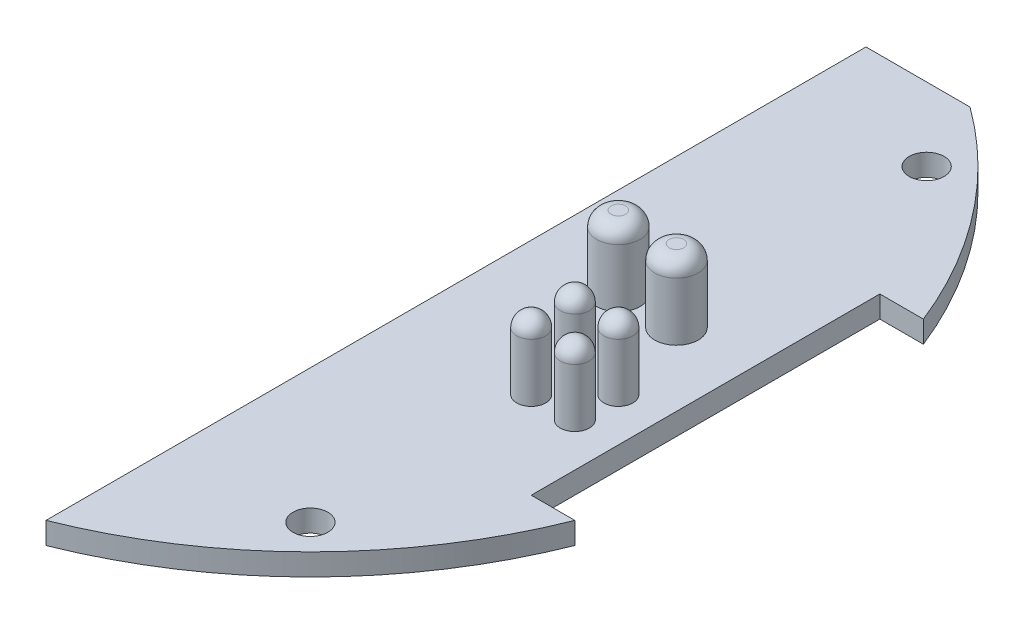
ISO-10303-21;
HEADER;
FILE_DESCRIPTION(('STEP AP214'),'2;1');
FILE_NAME('part.step','',(''),(''),'','','');
FILE_SCHEMA(('AUTOMOTIVE_DESIGN { 1 0 10303 214 1 1 1 1 }'));
ENDSEC;
DATA;
#1=APPLICATION_CONTEXT('core data for automotive mechanical design processes');
#2=APPLICATION_PROTOCOL_DEFINITION('international standard','automotive_design',2000,#1);
#3=PRODUCT_CONTEXT('',#1,'mechanical');
#4=PRODUCT('Part','Part','',(#3));
#5=PRODUCT_RELATED_PRODUCT_CATEGORY('part','',(#4));
#6=PRODUCT_DEFINITION_FORMATION('','',#4);
#7=PRODUCT_DEFINITION_CONTEXT('part definition',#1,'design');
#8=PRODUCT_DEFINITION('design','',#6,#7);
#9=PRODUCT_DEFINITION_SHAPE('','',#8);
#10=(LENGTH_UNIT() NAMED_UNIT(*) SI_UNIT(.MILLI.,.METRE.));
#11=(NAMED_UNIT(*) PLANE_ANGLE_UNIT() SI_UNIT($,.RADIAN.));
#12=(NAMED_UNIT(*) SI_UNIT($,.STERADIAN.) SOLID_ANGLE_UNIT());
#13=UNCERTAINTY_MEASURE_WITH_UNIT(LENGTH_MEASURE(1.E-05),#10,'distance_accuracy_value','');
#14=(GEOMETRIC_REPRESENTATION_CONTEXT(3) GLOBAL_UNCERTAINTY_ASSIGNED_CONTEXT((#13)) GLOBAL_UNIT_ASSIGNED_CONTEXT((#10,
#11,#12)) REPRESENTATION_CONTEXT('',''));
#15=CARTESIAN_POINT('',(0.,0.,0.));
#16=DIRECTION('',(0.,0.,1.));
#17=DIRECTION('',(1.,0.,0.));
#18=AXIS2_PLACEMENT_3D('',#15,#16,#17);
#19=CARTESIAN_POINT('',(0.,1.5,0.));
#20=DIRECTION('',(0.,-1.,0.));
#21=DIRECTION('',(0.,0.,-1.));
#22=AXIS2_PLACEMENT_3D('',#19,#20,#21);
#23=CYLINDRICAL_SURFACE('',#22,32.5);
#24=CARTESIAN_POINT('',(0.,0.,0.));
#25=DIRECTION('',(0.,1.,0.));
#26=DIRECTION('',(0.,0.,1.));
#27=AXIS2_PLACEMENT_3D('',#24,#25,#26);
#28=CIRCLE('',#27,32.5);
#29=CARTESIAN_POINT('',(11.9999999999999,0.,30.203476621078));
#30=VERTEX_POINT('',#29);
#31=CARTESIAN_POINT('',(30.2034766210779,0.,12.));
#32=VERTEX_POINT('',#31);
#33=EDGE_CURVE('E52',#30,#32,#28,.T.);
#34=ORIENTED_EDGE('',*,*,#33,.T.);
#35=DIRECTION('',(0.,1.,0.));
#36=VECTOR('',#35,1.);
#37=CARTESIAN_POINT('',(30.2034766210779,0.,12.));
#38=LINE('',#37,#36);
#39=CARTESIAN_POINT('',(30.2034766210779,1.5,12.));
#40=VERTEX_POINT('',#39);
#41=EDGE_CURVE('E144',#32,#40,#38,.T.);
#42=ORIENTED_EDGE('',*,*,#41,.T.);
#43=CARTESIAN_POINT('',(0.,1.5,0.));
#44=DIRECTION('',(0.,1.,0.));
#45=DIRECTION('',(0.,0.,1.));
#46=AXIS2_PLACEMENT_3D('',#43,#44,#45);
#47=CIRCLE('',#46,32.5);
#48=CARTESIAN_POINT('',(11.9999999999999,1.5,30.203476621078));
#49=VERTEX_POINT('',#48);
#50=EDGE_CURVE('E148',#49,#40,#47,.T.);
#51=ORIENTED_EDGE('',*,*,#50,.F.);
#52=DIRECTION('',(0.,1.,0.));
#53=VECTOR('',#52,1.);
#54=CARTESIAN_POINT('',(11.9999999999999,0.,30.203476621078));
#55=LINE('',#54,#53);
#56=EDGE_CURVE('E165',#30,#49,#55,.T.);
#57=ORIENTED_EDGE('',*,*,#56,.F.);
#58=EDGE_LOOP('',(#34,#42,#51,#57));
#59=FACE_BOUND('',#58,.T.);
#60=ADVANCED_FACE('F47',(#59),#23,.T.);
#61=CARTESIAN_POINT('',(0.,1.5,0.));
#62=DIRECTION('',(0.,1.,0.));
#63=DIRECTION('',(0.,0.,1.));
#64=AXIS2_PLACEMENT_3D('',#61,#62,#63);
#65=PLANE('',#64);
#66=DIRECTION('',(1.,0.,0.));
#67=VECTOR('',#66,1.);
#68=CARTESIAN_POINT('',(16.9999999999999,1.5,-26.2499999999999));
#69=LINE('',#68,#67);
#70=CARTESIAN_POINT('',(11.9999999999999,1.5,-26.25));
#71=VERTEX_POINT('',#70);
#72=CARTESIAN_POINT('',(19.162137145945,1.5,-26.2499999999999));
#73=VERTEX_POINT('',#72);
#74=EDGE_CURVE('E123',#71,#73,#69,.T.);
#75=ORIENTED_EDGE('',*,*,#74,.F.);
#76=DIRECTION('',(0.,0.,-1.));
#77=VECTOR('',#76,1.);
#78=CARTESIAN_POINT('',(11.9999999999999,1.5,30.203476621078));
#79=LINE('',#78,#77);
#80=EDGE_CURVE('E73',#49,#71,#79,.T.);
#81=ORIENTED_EDGE('',*,*,#80,.F.);
#82=ORIENTED_EDGE('',*,*,#50,.T.);
#83=DIRECTION('',(1.,0.,0.));
#84=VECTOR('',#83,1.);
#85=CARTESIAN_POINT('',(30.2034766210779,1.5,12.));
#86=LINE('',#85,#84);
#87=CARTESIAN_POINT('',(27.2034766210779,1.5,12.));
#88=VERTEX_POINT('',#87);
#89=EDGE_CURVE('E163',#88,#40,#86,.T.);
#90=ORIENTED_EDGE('',*,*,#89,.F.);
#91=DIRECTION('',(0.,0.,1.));
#92=VECTOR('',#91,1.);
#93=CARTESIAN_POINT('',(27.2034766210779,1.5,-12.));
#94=LINE('',#93,#92);
#95=CARTESIAN_POINT('',(27.2034766210779,1.5,-12.));
#96=VERTEX_POINT('',#95);
#97=EDGE_CURVE('E164',#96,#88,#94,.T.);
#98=ORIENTED_EDGE('',*,*,#97,.F.);
#99=DIRECTION('',(-1.,0.,0.));
#100=VECTOR('',#99,1.);
#101=CARTESIAN_POINT('',(30.2034766210779,1.5,-12.));
#102=LINE('',#101,#100);
#103=CARTESIAN_POINT('',(30.2034766210779,1.5,-12.));
#104=VERTEX_POINT('',#103);
#105=EDGE_CURVE('E167',#104,#96,#102,.T.);
#106=ORIENTED_EDGE('',*,*,#105,.F.);
#107=EDGE_CURVE('E157',#104,#73,#47,.T.);
#108=ORIENTED_EDGE('',*,*,#107,.T.);
#109=EDGE_LOOP('',(#75,#81,#82,#90,#98,#106,#108));
#110=FACE_BOUND('',#109,.T.);
#111=CARTESIAN_POINT('',(21.2034766210766,1.5,3.00000000000172));
#112=DIRECTION('',(0.,1.,0.));
#113=DIRECTION('',(0.,0.,1.));
#114=AXIS2_PLACEMENT_3D('',#111,#112,#113);
#115=CIRCLE('',#114,1.);
#116=CARTESIAN_POINT('',(21.2034766210766,1.5,4.00000000000173));
#117=VERTEX_POINT('',#116);
#118=EDGE_CURVE('E11',#117,#117,#115,.T.);
#119=ORIENTED_EDGE('',*,*,#118,.F.);
#120=EDGE_LOOP('',(#119));
#121=FACE_BOUND('',#120,.T.);
#122=CARTESIAN_POINT('',(21.2034766210765,1.5,6.00000000000172));
#123=DIRECTION('',(0.,1.,0.));
#124=DIRECTION('',(0.,0.,1.));
#125=AXIS2_PLACEMENT_3D('',#122,#123,#124);
#126=CIRCLE('',#125,1.);
#127=CARTESIAN_POINT('',(21.2034766210765,1.5,7.00000000000173));
#128=VERTEX_POINT('',#127);
#129=EDGE_CURVE('E206',#128,#128,#126,.T.);
#130=ORIENTED_EDGE('',*,*,#129,.F.);
#131=EDGE_LOOP('',(#130));
#132=FACE_BOUND('',#131,.T.);
#133=CARTESIAN_POINT('',(24.2034766210766,1.5,3.00000000000185));
#134=DIRECTION('',(0.,1.,0.));
#135=DIRECTION('',(0.,0.,1.));
#136=AXIS2_PLACEMENT_3D('',#133,#134,#135);
#137=CIRCLE('',#136,1.);
#138=CARTESIAN_POINT('',(24.2034766210766,1.5,4.00000000000185));
#139=VERTEX_POINT('',#138);
#140=EDGE_CURVE('E204',#139,#139,#137,.T.);
#141=ORIENTED_EDGE('',*,*,#140,.F.);
#142=EDGE_LOOP('',(#141));
#143=FACE_BOUND('',#142,.T.);
#144=CARTESIAN_POINT('',(24.2034766210765,1.5,6.00000000000185));
#145=DIRECTION('',(0.,1.,0.));
#146=DIRECTION('',(0.,0.,1.));
#147=AXIS2_PLACEMENT_3D('',#144,#145,#146);
#148=CIRCLE('',#147,1.);
#149=CARTESIAN_POINT('',(24.2034766210765,1.5,7.00000000000185));
#150=VERTEX_POINT('',#149);
#151=EDGE_CURVE('E198',#150,#150,#148,.T.);
#152=ORIENTED_EDGE('',*,*,#151,.F.);
#153=EDGE_LOOP('',(#152));
#154=FACE_BOUND('',#153,.T.);
#155=CARTESIAN_POINT('',(18.2034766210767,1.5,-2.99999999999834));
#156=DIRECTION('',(0.,1.,0.));
#157=DIRECTION('',(0.,0.,1.));
#158=AXIS2_PLACEMENT_3D('',#155,#156,#157);
#159=CIRCLE('',#158,1.5);
#160=CARTESIAN_POINT('',(18.2034766210767,1.5,-1.49999999999833));
#161=VERTEX_POINT('',#160);
#162=EDGE_CURVE('E194',#161,#161,#159,.T.);
#163=ORIENTED_EDGE('',*,*,#162,.F.);
#164=EDGE_LOOP('',(#163));
#165=FACE_BOUND('',#164,.T.);
#166=CARTESIAN_POINT('',(22.2034766210767,1.5,-2.99999999999821));
#167=DIRECTION('',(0.,1.,0.));
#168=DIRECTION('',(0.,0.,1.));
#169=AXIS2_PLACEMENT_3D('',#166,#167,#168);
#170=CIRCLE('',#169,1.5);
#171=CARTESIAN_POINT('',(22.2034766210767,1.5,-1.49999999999821));
#172=VERTEX_POINT('',#171);
#173=EDGE_CURVE('E189',#172,#172,#170,.T.);
#174=ORIENTED_EDGE('',*,*,#173,.F.);
#175=EDGE_LOOP('',(#174));
#176=FACE_BOUND('',#175,.T.);
#177=CARTESIAN_POINT('',(21.2132034355968,1.5,-21.213203435596));
#178=DIRECTION('',(0.,1.,0.));
#179=DIRECTION('',(0.,0.,1.));
#180=AXIS2_PLACEMENT_3D('',#177,#178,#179);
#181=CIRCLE('',#180,1.2);
#182=CARTESIAN_POINT('',(21.2132034355968,1.5,-20.013203435596));
#183=VERTEX_POINT('',#182);
#184=EDGE_CURVE('E128',#183,#183,#181,.T.);
#185=ORIENTED_EDGE('',*,*,#184,.F.);
#186=EDGE_LOOP('',(#185));
#187=FACE_BOUND('',#186,.T.);
#188=CARTESIAN_POINT('',(21.2132034355964,1.5,21.2132034355978));
#189=DIRECTION('',(0.,1.,0.));
#190=DIRECTION('',(0.,0.,1.));
#191=AXIS2_PLACEMENT_3D('',#188,#189,#190);
#192=CIRCLE('',#191,1.19999999999894);
#193=CARTESIAN_POINT('',(21.2132034355964,1.5,22.4132034355967));
#194=VERTEX_POINT('',#193);
#195=EDGE_CURVE('E230',#194,#194,#192,.T.);
#196=ORIENTED_EDGE('',*,*,#195,.F.);
#197=EDGE_LOOP('',(#196));
#198=FACE_BOUND('',#197,.T.);
#199=ADVANCED_FACE('F249',(#110,#121,#132,#143,#154,#165,#176,#187,#198),#65,.T.);
#200=CARTESIAN_POINT('',(0.,0.,0.));
#201=DIRECTION('',(0.,1.,0.));
#202=DIRECTION('',(0.,0.,1.));
#203=AXIS2_PLACEMENT_3D('',#200,#201,#202);
#204=PLANE('',#203);
#205=DIRECTION('',(0.,0.,-1.));
#206=VECTOR('',#205,1.);
#207=CARTESIAN_POINT('',(11.9999999999999,0.,30.203476621078));
#208=LINE('',#207,#206);
#209=CARTESIAN_POINT('',(11.9999999999999,0.,-26.25));
#210=VERTEX_POINT('',#209);
#211=EDGE_CURVE('E70',#30,#210,#208,.T.);
#212=ORIENTED_EDGE('',*,*,#211,.T.);
#213=DIRECTION('',(1.,0.,0.));
#214=VECTOR('',#213,1.);
#215=CARTESIAN_POINT('',(16.9999999999999,0.,-26.2499999999999));
#216=LINE('',#215,#214);
#217=CARTESIAN_POINT('',(19.162137145945,0.,-26.2499999999999));
#218=VERTEX_POINT('',#217);
#219=EDGE_CURVE('E109',#210,#218,#216,.T.);
#220=ORIENTED_EDGE('',*,*,#219,.T.);
#221=CARTESIAN_POINT('',(30.2034766210779,0.,-12.));
#222=VERTEX_POINT('',#221);
#223=EDGE_CURVE('E116',#222,#218,#28,.T.);
#224=ORIENTED_EDGE('',*,*,#223,.F.);
#225=DIRECTION('',(-1.,0.,0.));
#226=VECTOR('',#225,1.);
#227=CARTESIAN_POINT('',(30.2034766210779,0.,-12.));
#228=LINE('',#227,#226);
#229=CARTESIAN_POINT('',(27.2034766210779,0.,-12.));
#230=VERTEX_POINT('',#229);
#231=EDGE_CURVE('E118',#222,#230,#228,.T.);
#232=ORIENTED_EDGE('',*,*,#231,.T.);
#233=DIRECTION('',(0.,0.,1.));
#234=VECTOR('',#233,1.);
#235=CARTESIAN_POINT('',(27.2034766210779,0.,-12.));
#236=LINE('',#235,#234);
#237=CARTESIAN_POINT('',(27.2034766210779,0.,12.));
#238=VERTEX_POINT('',#237);
#239=EDGE_CURVE('E178',#230,#238,#236,.T.);
#240=ORIENTED_EDGE('',*,*,#239,.T.);
#241=DIRECTION('',(1.,0.,0.));
#242=VECTOR('',#241,1.);
#243=CARTESIAN_POINT('',(30.2034766210779,0.,12.));
#244=LINE('',#243,#242);
#245=EDGE_CURVE('E172',#238,#32,#244,.T.);
#246=ORIENTED_EDGE('',*,*,#245,.T.);
#247=ORIENTED_EDGE('',*,*,#33,.F.);
#248=EDGE_LOOP('',(#212,#220,#224,#232,#240,#246,#247));
#249=FACE_BOUND('',#248,.T.);
#250=CARTESIAN_POINT('',(21.2132034355968,0.,-21.213203435596));
#251=DIRECTION('',(0.,1.,0.));
#252=DIRECTION('',(0.,0.,1.));
#253=AXIS2_PLACEMENT_3D('',#250,#251,#252);
#254=CIRCLE('',#253,1.2);
#255=CARTESIAN_POINT('',(21.2132034355968,0.,-20.013203435596));
#256=VERTEX_POINT('',#255);
#257=EDGE_CURVE('E138',#256,#256,#254,.T.);
#258=ORIENTED_EDGE('',*,*,#257,.T.);
#259=EDGE_LOOP('',(#258));
#260=FACE_BOUND('',#259,.T.);
#261=CARTESIAN_POINT('',(21.2132034355964,0.,21.2132034355978));
#262=DIRECTION('',(0.,1.,0.));
#263=DIRECTION('',(0.,0.,1.));
#264=AXIS2_PLACEMENT_3D('',#261,#262,#263);
#265=CIRCLE('',#264,1.19999999999894);
#266=CARTESIAN_POINT('',(21.2132034355964,0.,22.4132034355967));
#267=VERTEX_POINT('',#266);
#268=EDGE_CURVE('E134',#267,#267,#265,.T.);
#269=ORIENTED_EDGE('',*,*,#268,.T.);
#270=EDGE_LOOP('',(#269));
#271=FACE_BOUND('',#270,.T.);
#272=ADVANCED_FACE('F115',(#249,#260,#271),#204,.F.);
#273=ORIENTED_EDGE('',*,*,#223,.T.);
#274=DIRECTION('',(0.,-1.,0.));
#275=VECTOR('',#274,1.);
#276=CARTESIAN_POINT('',(19.162137145945,1.5,-26.2499999999999));
#277=LINE('',#276,#275);
#278=EDGE_CURVE('E125',#218,#73,#277,.F.);
#279=ORIENTED_EDGE('',*,*,#278,.T.);
#280=ORIENTED_EDGE('',*,*,#107,.F.);
#281=DIRECTION('',(0.,1.,0.));
#282=VECTOR('',#281,1.);
#283=CARTESIAN_POINT('',(30.2034766210779,0.,-12.));
#284=LINE('',#283,#282);
#285=EDGE_CURVE('E133',#222,#104,#284,.T.);
#286=ORIENTED_EDGE('',*,*,#285,.F.);
#287=EDGE_LOOP('',(#273,#279,#280,#286));
#288=FACE_BOUND('',#287,.T.);
#289=ADVANCED_FACE('F51',(#288),#23,.T.);
#290=CARTESIAN_POINT('',(21.2132034355968,1.5,-21.213203435596));
#291=DIRECTION('',(0.,-1.,0.));
#292=DIRECTION('',(0.,0.,-1.));
#293=AXIS2_PLACEMENT_3D('',#290,#291,#292);
#294=CYLINDRICAL_SURFACE('',#293,1.2);
#295=ORIENTED_EDGE('',*,*,#184,.T.);
#296=EDGE_LOOP('',(#295));
#297=FACE_BOUND('',#296,.T.);
#298=ORIENTED_EDGE('',*,*,#257,.F.);
#299=EDGE_LOOP('',(#298));
#300=FACE_BOUND('',#299,.T.);
#301=ADVANCED_FACE('F288',(#297,#300),#294,.F.);
#302=CARTESIAN_POINT('',(21.2132034355964,1.5,21.2132034355978));
#303=DIRECTION('',(0.,-1.,0.));
#304=DIRECTION('',(0.,0.,-1.));
#305=AXIS2_PLACEMENT_3D('',#302,#303,#304);
#306=CYLINDRICAL_SURFACE('',#305,1.19999999999894);
#307=ORIENTED_EDGE('',*,*,#195,.T.);
#308=EDGE_LOOP('',(#307));
#309=FACE_BOUND('',#308,.T.);
#310=ORIENTED_EDGE('',*,*,#268,.F.);
#311=EDGE_LOOP('',(#310));
#312=FACE_BOUND('',#311,.T.);
#313=ADVANCED_FACE('F282',(#309,#312),#306,.F.);
#314=CARTESIAN_POINT('',(11.9999999999999,0.,30.203476621078));
#315=DIRECTION('',(1.,0.,0.));
#316=DIRECTION('',(0.,0.,-1.));
#317=AXIS2_PLACEMENT_3D('',#314,#315,#316);
#318=PLANE('',#317);
#319=ORIENTED_EDGE('',*,*,#80,.T.);
#320=DIRECTION('',(0.,1.,0.));
#321=VECTOR('',#320,1.);
#322=CARTESIAN_POINT('',(11.9999999999999,0.,-26.25));
#323=LINE('',#322,#321);
#324=EDGE_CURVE('E187',#210,#71,#323,.T.);
#325=ORIENTED_EDGE('',*,*,#324,.F.);
#326=ORIENTED_EDGE('',*,*,#211,.F.);
#327=ORIENTED_EDGE('',*,*,#56,.T.);
#328=EDGE_LOOP('',(#319,#325,#326,#327));
#329=FACE_BOUND('',#328,.T.);
#330=ADVANCED_FACE('F285',(#329),#318,.F.);
#331=CARTESIAN_POINT('',(30.2034766210779,0.,12.));
#332=DIRECTION('',(0.,0.,1.));
#333=DIRECTION('',(1.,0.,0.));
#334=AXIS2_PLACEMENT_3D('',#331,#332,#333);
#335=PLANE('',#334);
#336=ORIENTED_EDGE('',*,*,#89,.T.);
#337=ORIENTED_EDGE('',*,*,#41,.F.);
#338=ORIENTED_EDGE('',*,*,#245,.F.);
#339=DIRECTION('',(0.,1.,0.));
#340=VECTOR('',#339,1.);
#341=CARTESIAN_POINT('',(27.2034766210779,0.,12.));
#342=LINE('',#341,#340);
#343=EDGE_CURVE('E156',#238,#88,#342,.T.);
#344=ORIENTED_EDGE('',*,*,#343,.T.);
#345=EDGE_LOOP('',(#336,#337,#338,#344));
#346=FACE_BOUND('',#345,.T.);
#347=ADVANCED_FACE('F254',(#346),#335,.F.);
#348=CARTESIAN_POINT('',(27.2034766210779,0.,-12.));
#349=DIRECTION('',(-1.,0.,0.));
#350=DIRECTION('',(0.,0.,1.));
#351=AXIS2_PLACEMENT_3D('',#348,#349,#350);
#352=PLANE('',#351);
#353=ORIENTED_EDGE('',*,*,#97,.T.);
#354=ORIENTED_EDGE('',*,*,#343,.F.);
#355=ORIENTED_EDGE('',*,*,#239,.F.);
#356=DIRECTION('',(0.,1.,0.));
#357=VECTOR('',#356,1.);
#358=CARTESIAN_POINT('',(27.2034766210779,0.,-12.));
#359=LINE('',#358,#357);
#360=EDGE_CURVE('E169',#230,#96,#359,.T.);
#361=ORIENTED_EDGE('',*,*,#360,.T.);
#362=EDGE_LOOP('',(#353,#354,#355,#361));
#363=FACE_BOUND('',#362,.T.);
#364=ADVANCED_FACE('F243',(#363),#352,.F.);
#365=CARTESIAN_POINT('',(30.2034766210779,0.,-12.));
#366=DIRECTION('',(0.,0.,-1.));
#367=DIRECTION('',(-1.,0.,0.));
#368=AXIS2_PLACEMENT_3D('',#365,#366,#367);
#369=PLANE('',#368);
#370=ORIENTED_EDGE('',*,*,#105,.T.);
#371=ORIENTED_EDGE('',*,*,#360,.F.);
#372=ORIENTED_EDGE('',*,*,#231,.F.);
#373=ORIENTED_EDGE('',*,*,#285,.T.);
#374=EDGE_LOOP('',(#370,#371,#372,#373));
#375=FACE_BOUND('',#374,.T.);
#376=ADVANCED_FACE('F247',(#375),#369,.F.);
#377=CARTESIAN_POINT('',(16.9999999999999,0.,-26.2499999999999));
#378=DIRECTION('',(0.,0.,1.));
#379=DIRECTION('',(1.,0.,0.));
#380=AXIS2_PLACEMENT_3D('',#377,#378,#379);
#381=PLANE('',#380);
#382=ORIENTED_EDGE('',*,*,#219,.F.);
#383=ORIENTED_EDGE('',*,*,#324,.T.);
#384=ORIENTED_EDGE('',*,*,#74,.T.);
#385=ORIENTED_EDGE('',*,*,#278,.F.);
#386=EDGE_LOOP('',(#382,#383,#384,#385));
#387=FACE_BOUND('',#386,.T.);
#388=ADVANCED_FACE('F124',(#387),#381,.F.);
#389=CARTESIAN_POINT('',(22.2034766210767,6.5,-2.99999999999821));
#390=DIRECTION('',(0.,-1.,0.));
#391=DIRECTION('',(0.,0.,-1.));
#392=AXIS2_PLACEMENT_3D('',#389,#390,#391);
#393=CYLINDRICAL_SURFACE('',#392,1.5);
#394=CARTESIAN_POINT('',(22.2034766210767,5.5,-2.99999999999821));
#395=DIRECTION('',(0.,1.,0.));
#396=DIRECTION('',(0.,0.,1.));
#397=AXIS2_PLACEMENT_3D('',#394,#395,#396);
#398=CIRCLE('',#397,1.5);
#399=CARTESIAN_POINT('',(22.2034766210767,5.5,-1.49999999999821));
#400=VERTEX_POINT('',#399);
#401=EDGE_CURVE('E184',#400,#400,#398,.F.);
#402=ORIENTED_EDGE('',*,*,#401,.T.);
#403=EDGE_LOOP('',(#402));
#404=FACE_BOUND('',#403,.T.);
#405=ORIENTED_EDGE('',*,*,#173,.T.);
#406=EDGE_LOOP('',(#405));
#407=FACE_BOUND('',#406,.T.);
#408=ADVANCED_FACE('F329',(#404,#407),#393,.T.);
#409=CARTESIAN_POINT('',(22.2034766210767,6.5,-2.99999999999821));
#410=DIRECTION('',(0.,1.,0.));
#411=DIRECTION('',(0.,0.,1.));
#412=AXIS2_PLACEMENT_3D('',#409,#410,#411);
#413=PLANE('',#412);
#414=CARTESIAN_POINT('',(22.2034766210767,6.5,-2.99999999999821));
#415=DIRECTION('',(0.,1.,0.));
#416=DIRECTION('',(0.,0.,1.));
#417=AXIS2_PLACEMENT_3D('',#414,#415,#416);
#418=CIRCLE('',#417,0.500000000000001);
#419=CARTESIAN_POINT('',(22.2034766210767,6.5,-2.49999999999821));
#420=VERTEX_POINT('',#419);
#421=EDGE_CURVE('E195',#420,#420,#418,.T.);
#422=ORIENTED_EDGE('',*,*,#421,.T.);
#423=EDGE_LOOP('',(#422));
#424=FACE_BOUND('',#423,.T.);
#425=ADVANCED_FACE('F323',(#424),#413,.T.);
#426=CARTESIAN_POINT('',(18.2034766210767,6.5,-2.99999999999834));
#427=DIRECTION('',(0.,-1.,0.));
#428=DIRECTION('',(0.,0.,-1.));
#429=AXIS2_PLACEMENT_3D('',#426,#427,#428);
#430=CYLINDRICAL_SURFACE('',#429,1.5);
#431=CARTESIAN_POINT('',(18.2034766210767,5.5,-2.99999999999834));
#432=DIRECTION('',(0.,1.,0.));
#433=DIRECTION('',(0.,0.,1.));
#434=AXIS2_PLACEMENT_3D('',#431,#432,#433);
#435=CIRCLE('',#434,1.5);
#436=CARTESIAN_POINT('',(18.2034766210767,5.5,-1.49999999999833));
#437=VERTEX_POINT('',#436);
#438=EDGE_CURVE('E200',#437,#437,#435,.F.);
#439=ORIENTED_EDGE('',*,*,#438,.T.);
#440=EDGE_LOOP('',(#439));
#441=FACE_BOUND('',#440,.T.);
#442=ORIENTED_EDGE('',*,*,#162,.T.);
#443=EDGE_LOOP('',(#442));
#444=FACE_BOUND('',#443,.T.);
#445=ADVANCED_FACE('F325',(#441,#444),#430,.T.);
#446=CARTESIAN_POINT('',(18.2034766210767,6.5,-2.99999999999834));
#447=DIRECTION('',(0.,1.,0.));
#448=DIRECTION('',(0.,0.,1.));
#449=AXIS2_PLACEMENT_3D('',#446,#447,#448);
#450=PLANE('',#449);
#451=CARTESIAN_POINT('',(18.2034766210767,6.5,-2.99999999999834));
#452=DIRECTION('',(0.,1.,0.));
#453=DIRECTION('',(0.,0.,1.));
#454=AXIS2_PLACEMENT_3D('',#451,#452,#453);
#455=CIRCLE('',#454,0.500000000000001);
#456=CARTESIAN_POINT('',(18.2034766210767,6.5,-2.49999999999834));
#457=VERTEX_POINT('',#456);
#458=EDGE_CURVE('E196',#457,#457,#455,.T.);
#459=ORIENTED_EDGE('',*,*,#458,.T.);
#460=EDGE_LOOP('',(#459));
#461=FACE_BOUND('',#460,.T.);
#462=ADVANCED_FACE('F322',(#461),#450,.T.);
#463=CARTESIAN_POINT('',(24.2034766210765,6.5,6.00000000000185));
#464=DIRECTION('',(0.,-1.,0.));
#465=DIRECTION('',(0.,0.,-1.));
#466=AXIS2_PLACEMENT_3D('',#463,#464,#465);
#467=CYLINDRICAL_SURFACE('',#466,1.);
#468=CARTESIAN_POINT('',(24.2034766210765,5.5,6.00000000000185));
#469=DIRECTION('',(0.,-1.,0.));
#470=DIRECTION('',(0.,0.,-1.));
#471=AXIS2_PLACEMENT_3D('',#468,#469,#470);
#472=CIRCLE('',#471,1.);
#473=CARTESIAN_POINT('',(24.2034766210765,5.5,5.00000000000185));
#474=VERTEX_POINT('',#473);
#475=EDGE_CURVE('E205',#474,#474,#472,.T.);
#476=ORIENTED_EDGE('',*,*,#475,.T.);
#477=EDGE_LOOP('',(#476));
#478=FACE_BOUND('',#477,.T.);
#479=ORIENTED_EDGE('',*,*,#151,.T.);
#480=EDGE_LOOP('',(#479));
#481=FACE_BOUND('',#480,.T.);
#482=ADVANCED_FACE('F320',(#478,#481),#467,.T.);
#483=CARTESIAN_POINT('',(24.2034766210766,6.5,3.00000000000185));
#484=DIRECTION('',(0.,-1.,0.));
#485=DIRECTION('',(0.,0.,-1.));
#486=AXIS2_PLACEMENT_3D('',#483,#484,#485);
#487=CYLINDRICAL_SURFACE('',#486,1.);
#488=CARTESIAN_POINT('',(24.2034766210766,5.5,3.00000000000185));
#489=DIRECTION('',(0.,-1.,0.));
#490=DIRECTION('',(0.,0.,-1.));
#491=AXIS2_PLACEMENT_3D('',#488,#489,#490);
#492=CIRCLE('',#491,1.);
#493=CARTESIAN_POINT('',(24.2034766210766,5.5,2.00000000000185));
#494=VERTEX_POINT('',#493);
#495=EDGE_CURVE('E202',#494,#494,#492,.T.);
#496=ORIENTED_EDGE('',*,*,#495,.T.);
#497=EDGE_LOOP('',(#496));
#498=FACE_BOUND('',#497,.T.);
#499=ORIENTED_EDGE('',*,*,#140,.T.);
#500=EDGE_LOOP('',(#499));
#501=FACE_BOUND('',#500,.T.);
#502=ADVANCED_FACE('F313',(#498,#501),#487,.T.);
#503=CARTESIAN_POINT('',(21.2034766210765,6.5,6.00000000000172));
#504=DIRECTION('',(0.,-1.,0.));
#505=DIRECTION('',(0.,0.,-1.));
#506=AXIS2_PLACEMENT_3D('',#503,#504,#505);
#507=CYLINDRICAL_SURFACE('',#506,1.);
#508=CARTESIAN_POINT('',(21.2034766210765,5.5,6.00000000000172));
#509=DIRECTION('',(0.,-1.,0.));
#510=DIRECTION('',(0.,0.,-1.));
#511=AXIS2_PLACEMENT_3D('',#508,#509,#510);
#512=CIRCLE('',#511,1.);
#513=CARTESIAN_POINT('',(21.2034766210765,5.5,5.00000000000172));
#514=VERTEX_POINT('',#513);
#515=EDGE_CURVE('E210',#514,#514,#512,.T.);
#516=ORIENTED_EDGE('',*,*,#515,.T.);
#517=EDGE_LOOP('',(#516));
#518=FACE_BOUND('',#517,.T.);
#519=ORIENTED_EDGE('',*,*,#129,.T.);
#520=EDGE_LOOP('',(#519));
#521=FACE_BOUND('',#520,.T.);
#522=ADVANCED_FACE('F309',(#518,#521),#507,.T.);
#523=CARTESIAN_POINT('',(21.2034766210766,6.5,3.00000000000172));
#524=DIRECTION('',(0.,-1.,0.));
#525=DIRECTION('',(0.,0.,-1.));
#526=AXIS2_PLACEMENT_3D('',#523,#524,#525);
#527=CYLINDRICAL_SURFACE('',#526,1.);
#528=CARTESIAN_POINT('',(21.2034766210766,5.5,3.00000000000172));
#529=DIRECTION('',(0.,-1.,0.));
#530=DIRECTION('',(0.,0.,-1.));
#531=AXIS2_PLACEMENT_3D('',#528,#529,#530);
#532=CIRCLE('',#531,1.);
#533=CARTESIAN_POINT('',(21.2034766210766,5.5,2.00000000000172));
#534=VERTEX_POINT('',#533);
#535=EDGE_CURVE('E56',#534,#534,#532,.T.);
#536=ORIENTED_EDGE('',*,*,#535,.T.);
#537=EDGE_LOOP('',(#536));
#538=FACE_BOUND('',#537,.T.);
#539=ORIENTED_EDGE('',*,*,#118,.T.);
#540=EDGE_LOOP('',(#539));
#541=FACE_BOUND('',#540,.T.);
#542=ADVANCED_FACE('F306',(#538,#541),#527,.T.);
#543=CARTESIAN_POINT('',(21.2034766210765,5.5,6.00000000000172));
#544=DIRECTION('',(0.,1.,0.));
#545=DIRECTION('',(0.,0.,1.));
#546=AXIS2_PLACEMENT_3D('',#543,#544,#545);
#547=SPHERICAL_SURFACE('',#546,1.);
#548=ORIENTED_EDGE('',*,*,#515,.F.);
#549=EDGE_LOOP('',(#548));
#550=FACE_BOUND('',#549,.T.);
#551=ADVANCED_FACE('F307',(#550),#547,.T.);
#552=CARTESIAN_POINT('',(18.2034766210767,5.5,-2.99999999999834));
#553=DIRECTION('',(0.,1.,0.));
#554=DIRECTION('',(0.,0.,1.));
#555=AXIS2_PLACEMENT_3D('',#552,#553,#554);
#556=DEGENERATE_TOROIDAL_SURFACE('',#555,0.500000000000001,1.,.T.);
#557=ORIENTED_EDGE('',*,*,#438,.F.);
#558=EDGE_LOOP('',(#557));
#559=FACE_BOUND('',#558,.T.);
#560=ORIENTED_EDGE('',*,*,#458,.F.);
#561=EDGE_LOOP('',(#560));
#562=FACE_BOUND('',#561,.T.);
#563=ADVANCED_FACE('F375',(#559,#562),#556,.T.);
#564=CARTESIAN_POINT('',(21.2034766210766,5.5,3.00000000000172));
#565=DIRECTION('',(0.,1.,0.));
#566=DIRECTION('',(0.,0.,1.));
#567=AXIS2_PLACEMENT_3D('',#564,#565,#566);
#568=SPHERICAL_SURFACE('',#567,1.);
#569=ORIENTED_EDGE('',*,*,#535,.F.);
#570=EDGE_LOOP('',(#569));
#571=FACE_BOUND('',#570,.T.);
#572=ADVANCED_FACE('F378',(#571),#568,.T.);
#573=CARTESIAN_POINT('',(24.2034766210765,5.5,6.00000000000185));
#574=DIRECTION('',(0.,1.,0.));
#575=DIRECTION('',(0.,0.,1.));
#576=AXIS2_PLACEMENT_3D('',#573,#574,#575);
#577=SPHERICAL_SURFACE('',#576,1.);
#578=ORIENTED_EDGE('',*,*,#475,.F.);
#579=EDGE_LOOP('',(#578));
#580=FACE_BOUND('',#579,.T.);
#581=ADVANCED_FACE('F387',(#580),#577,.T.);
#582=CARTESIAN_POINT('',(24.2034766210766,5.5,3.00000000000185));
#583=DIRECTION('',(0.,1.,0.));
#584=DIRECTION('',(0.,0.,1.));
#585=AXIS2_PLACEMENT_3D('',#582,#583,#584);
#586=SPHERICAL_SURFACE('',#585,1.);
#587=ORIENTED_EDGE('',*,*,#495,.F.);
#588=EDGE_LOOP('',(#587));
#589=FACE_BOUND('',#588,.T.);
#590=ADVANCED_FACE('F393',(#589),#586,.T.);
#591=CARTESIAN_POINT('',(22.2034766210767,5.5,-2.99999999999821));
#592=DIRECTION('',(0.,1.,0.));
#593=DIRECTION('',(0.,0.,1.));
#594=AXIS2_PLACEMENT_3D('',#591,#592,#593);
#595=DEGENERATE_TOROIDAL_SURFACE('',#594,0.500000000000001,1.,.T.);
#596=ORIENTED_EDGE('',*,*,#401,.F.);
#597=EDGE_LOOP('',(#596));
#598=FACE_BOUND('',#597,.T.);
#599=ORIENTED_EDGE('',*,*,#421,.F.);
#600=EDGE_LOOP('',(#599));
#601=FACE_BOUND('',#600,.T.);
#602=ADVANCED_FACE('F398',(#598,#601),#595,.T.);
#603=CLOSED_SHELL('',(#60,#199,#272,#289,#301,#313,#330,#347,#364,#376,#388,#408,#425,#445,#462,
#482,#502,#522,#542,#551,#563,#572,#581,#590,#602));
#604=MANIFOLD_SOLID_BREP('B2',#603);
#605=ADVANCED_BREP_SHAPE_REPRESENTATION('',(#18,#604),#14);
#606=SHAPE_DEFINITION_REPRESENTATION(#9,#605);
ENDSEC;
END-ISO-10303-21;
